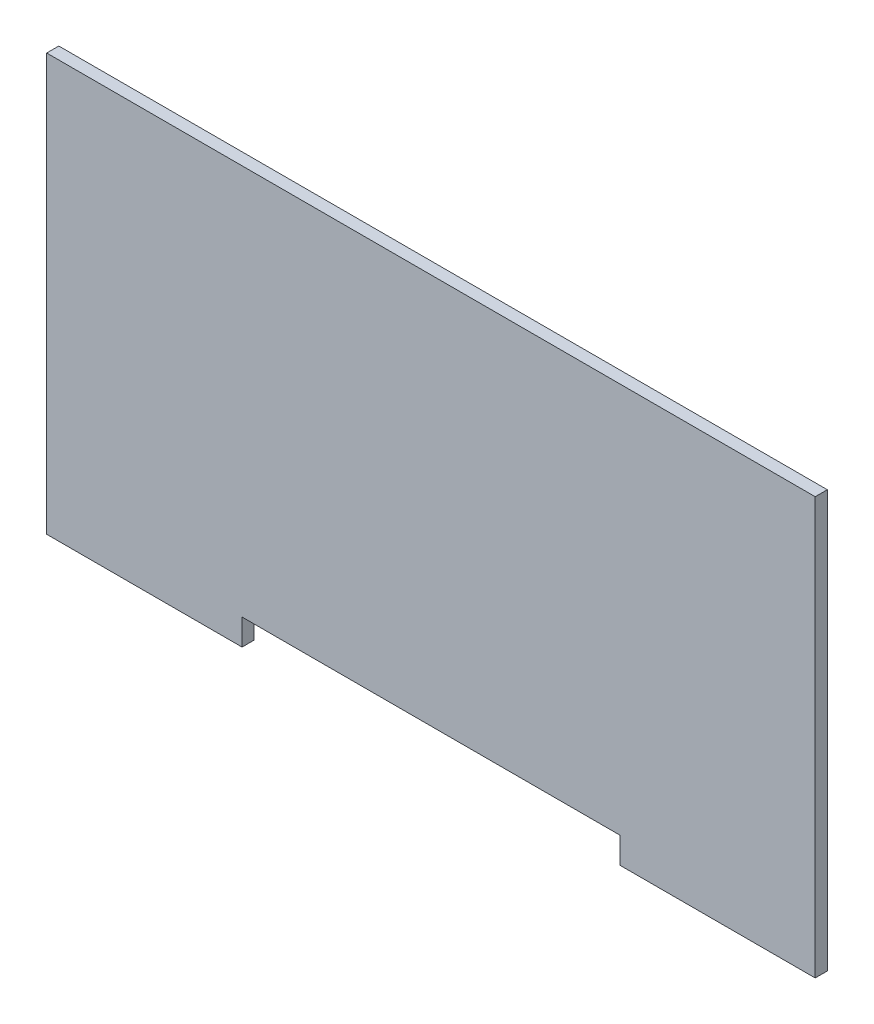
ISO-10303-21;
HEADER;
FILE_DESCRIPTION(('STEP AP214'),'2;1');
FILE_NAME('part.step','',(''),(''),'','','');
FILE_SCHEMA(('AUTOMOTIVE_DESIGN { 1 0 10303 214 1 1 1 1 }'));
ENDSEC;
DATA;
#1=APPLICATION_CONTEXT('core data for automotive mechanical design processes');
#2=APPLICATION_PROTOCOL_DEFINITION('international standard','automotive_design',2000,#1);
#3=PRODUCT_CONTEXT('',#1,'mechanical');
#4=PRODUCT('Part','Part','',(#3));
#5=PRODUCT_RELATED_PRODUCT_CATEGORY('part','',(#4));
#6=PRODUCT_DEFINITION_FORMATION('','',#4);
#7=PRODUCT_DEFINITION_CONTEXT('part definition',#1,'design');
#8=PRODUCT_DEFINITION('design','',#6,#7);
#9=PRODUCT_DEFINITION_SHAPE('','',#8);
#10=(LENGTH_UNIT() NAMED_UNIT(*) SI_UNIT(.MILLI.,.METRE.));
#11=(NAMED_UNIT(*) PLANE_ANGLE_UNIT() SI_UNIT($,.RADIAN.));
#12=(NAMED_UNIT(*) SI_UNIT($,.STERADIAN.) SOLID_ANGLE_UNIT());
#13=UNCERTAINTY_MEASURE_WITH_UNIT(LENGTH_MEASURE(1.E-05),#10,'distance_accuracy_value','');
#14=(GEOMETRIC_REPRESENTATION_CONTEXT(3) GLOBAL_UNCERTAINTY_ASSIGNED_CONTEXT((#13)) GLOBAL_UNIT_ASSIGNED_CONTEXT((#10,
#11,#12)) REPRESENTATION_CONTEXT('',''));
#15=CARTESIAN_POINT('',(0.,0.,0.));
#16=DIRECTION('',(0.,0.,1.));
#17=DIRECTION('',(1.,0.,0.));
#18=AXIS2_PLACEMENT_3D('',#15,#16,#17);
#19=CARTESIAN_POINT('',(147.5,0.,4.65));
#20=DIRECTION('',(1.,0.,0.));
#21=DIRECTION('',(0.,0.,-1.));
#22=AXIS2_PLACEMENT_3D('',#19,#20,#21);
#23=PLANE('',#22);
#24=DIRECTION('',(0.,-1.,0.));
#25=VECTOR('',#24,1.);
#26=CARTESIAN_POINT('',(147.5,0.,0.));
#27=LINE('',#26,#25);
#28=CARTESIAN_POINT('',(147.5,75.,0.));
#29=VERTEX_POINT('',#28);
#30=CARTESIAN_POINT('',(147.5,-85.,0.));
#31=VERTEX_POINT('',#30);
#32=EDGE_CURVE('E130',#29,#31,#27,.T.);
#33=ORIENTED_EDGE('',*,*,#32,.F.);
#34=DIRECTION('',(0.,0.,-1.));
#35=VECTOR('',#34,1.);
#36=CARTESIAN_POINT('',(147.5,75.,4.65));
#37=LINE('',#36,#35);
#38=CARTESIAN_POINT('',(147.5,75.,4.65));
#39=VERTEX_POINT('',#38);
#40=EDGE_CURVE('E81',#39,#29,#37,.T.);
#41=ORIENTED_EDGE('',*,*,#40,.F.);
#42=DIRECTION('',(0.,-1.,0.));
#43=VECTOR('',#42,1.);
#44=CARTESIAN_POINT('',(147.5,0.,4.65));
#45=LINE('',#44,#43);
#46=CARTESIAN_POINT('',(147.5,-85.,4.65));
#47=VERTEX_POINT('',#46);
#48=EDGE_CURVE('E157',#39,#47,#45,.T.);
#49=ORIENTED_EDGE('',*,*,#48,.T.);
#50=DIRECTION('',(0.,0.,-1.));
#51=VECTOR('',#50,1.);
#52=CARTESIAN_POINT('',(147.5,-85.,4.65));
#53=LINE('',#52,#51);
#54=EDGE_CURVE('E150',#47,#31,#53,.T.);
#55=ORIENTED_EDGE('',*,*,#54,.T.);
#56=EDGE_LOOP('',(#33,#41,#49,#55));
#57=FACE_BOUND('',#56,.T.);
#58=ADVANCED_FACE('F71',(#57),#23,.T.);
#59=CARTESIAN_POINT('',(0.,75.,4.65));
#60=DIRECTION('',(0.,1.,0.));
#61=DIRECTION('',(0.,0.,1.));
#62=AXIS2_PLACEMENT_3D('',#59,#60,#61);
#63=PLANE('',#62);
#64=DIRECTION('',(1.,0.,0.));
#65=VECTOR('',#64,1.);
#66=CARTESIAN_POINT('',(0.,75.,0.));
#67=LINE('',#66,#65);
#68=CARTESIAN_POINT('',(-147.5,75.,0.));
#69=VERTEX_POINT('',#68);
#70=EDGE_CURVE('E123',#69,#29,#67,.T.);
#71=ORIENTED_EDGE('',*,*,#70,.F.);
#72=DIRECTION('',(0.,0.,-1.));
#73=VECTOR('',#72,1.);
#74=CARTESIAN_POINT('',(-147.5,75.,4.65));
#75=LINE('',#74,#73);
#76=CARTESIAN_POINT('',(-147.5,75.,4.65));
#77=VERTEX_POINT('',#76);
#78=EDGE_CURVE('E117',#77,#69,#75,.T.);
#79=ORIENTED_EDGE('',*,*,#78,.F.);
#80=DIRECTION('',(1.,0.,0.));
#81=VECTOR('',#80,1.);
#82=CARTESIAN_POINT('',(0.,75.,4.65));
#83=LINE('',#82,#81);
#84=EDGE_CURVE('E175',#77,#39,#83,.T.);
#85=ORIENTED_EDGE('',*,*,#84,.T.);
#86=ORIENTED_EDGE('',*,*,#40,.T.);
#87=EDGE_LOOP('',(#71,#79,#85,#86));
#88=FACE_BOUND('',#87,.T.);
#89=ADVANCED_FACE('F210',(#88),#63,.T.);
#90=CARTESIAN_POINT('',(-147.5,0.,4.65));
#91=DIRECTION('',(1.,0.,0.));
#92=DIRECTION('',(0.,1.,0.));
#93=AXIS2_PLACEMENT_3D('',#90,#91,#92);
#94=PLANE('',#93);
#95=DIRECTION('',(0.,-1.,0.));
#96=VECTOR('',#95,1.);
#97=CARTESIAN_POINT('',(-147.5,0.,0.));
#98=LINE('',#97,#96);
#99=CARTESIAN_POINT('',(-147.5,-85.,0.));
#100=VERTEX_POINT('',#99);
#101=EDGE_CURVE('E109',#69,#100,#98,.T.);
#102=ORIENTED_EDGE('',*,*,#101,.T.);
#103=DIRECTION('',(0.,0.,-1.));
#104=VECTOR('',#103,1.);
#105=CARTESIAN_POINT('',(-147.5,-85.,4.65));
#106=LINE('',#105,#104);
#107=CARTESIAN_POINT('',(-147.5,-85.,4.65));
#108=VERTEX_POINT('',#107);
#109=EDGE_CURVE('E113',#108,#100,#106,.T.);
#110=ORIENTED_EDGE('',*,*,#109,.F.);
#111=DIRECTION('',(0.,-1.,0.));
#112=VECTOR('',#111,1.);
#113=CARTESIAN_POINT('',(-147.5,0.,4.65));
#114=LINE('',#113,#112);
#115=EDGE_CURVE('E173',#77,#108,#114,.T.);
#116=ORIENTED_EDGE('',*,*,#115,.F.);
#117=ORIENTED_EDGE('',*,*,#78,.T.);
#118=EDGE_LOOP('',(#102,#110,#116,#117));
#119=FACE_BOUND('',#118,.T.);
#120=ADVANCED_FACE('F111',(#119),#94,.F.);
#121=CARTESIAN_POINT('',(0.,-75.,4.65));
#122=DIRECTION('',(0.,1.,0.));
#123=DIRECTION('',(-1.,0.,0.));
#124=AXIS2_PLACEMENT_3D('',#121,#122,#123);
#125=PLANE('',#124);
#126=DIRECTION('',(1.,0.,0.));
#127=VECTOR('',#126,1.);
#128=CARTESIAN_POINT('',(0.,-75.,4.65));
#129=LINE('',#128,#127);
#130=CARTESIAN_POINT('',(-72.5,-75.,4.65));
#131=VERTEX_POINT('',#130);
#132=CARTESIAN_POINT('',(72.5,-75.,4.65));
#133=VERTEX_POINT('',#132);
#134=EDGE_CURVE('E170',#131,#133,#129,.T.);
#135=ORIENTED_EDGE('',*,*,#134,.F.);
#136=DIRECTION('',(0.,0.,-1.));
#137=VECTOR('',#136,1.);
#138=CARTESIAN_POINT('',(-72.5,-75.,4.65));
#139=LINE('',#138,#137);
#140=CARTESIAN_POINT('',(-72.5,-75.,0.));
#141=VERTEX_POINT('',#140);
#142=EDGE_CURVE('E12',#131,#141,#139,.T.);
#143=ORIENTED_EDGE('',*,*,#142,.T.);
#144=DIRECTION('',(1.,0.,0.));
#145=VECTOR('',#144,1.);
#146=CARTESIAN_POINT('',(0.,-75.,0.));
#147=LINE('',#146,#145);
#148=CARTESIAN_POINT('',(72.5,-75.,0.));
#149=VERTEX_POINT('',#148);
#150=EDGE_CURVE('E122',#141,#149,#147,.T.);
#151=ORIENTED_EDGE('',*,*,#150,.T.);
#152=DIRECTION('',(0.,0.,-1.));
#153=VECTOR('',#152,1.);
#154=CARTESIAN_POINT('',(72.5,-75.,4.65));
#155=LINE('',#154,#153);
#156=EDGE_CURVE('E144',#133,#149,#155,.T.);
#157=ORIENTED_EDGE('',*,*,#156,.F.);
#158=EDGE_LOOP('',(#135,#143,#151,#157));
#159=FACE_BOUND('',#158,.T.);
#160=ADVANCED_FACE('F225',(#159),#125,.F.);
#161=CARTESIAN_POINT('',(72.5,0.,4.65));
#162=DIRECTION('',(1.,0.,0.));
#163=DIRECTION('',(0.,0.,-1.));
#164=AXIS2_PLACEMENT_3D('',#161,#162,#163);
#165=PLANE('',#164);
#166=DIRECTION('',(0.,-1.,0.));
#167=VECTOR('',#166,1.);
#168=CARTESIAN_POINT('',(72.5,0.,0.));
#169=LINE('',#168,#167);
#170=CARTESIAN_POINT('',(72.5,-85.,0.));
#171=VERTEX_POINT('',#170);
#172=EDGE_CURVE('E158',#149,#171,#169,.T.);
#173=ORIENTED_EDGE('',*,*,#172,.T.);
#174=DIRECTION('',(0.,0.,-1.));
#175=VECTOR('',#174,1.);
#176=CARTESIAN_POINT('',(72.5,-85.,4.65));
#177=LINE('',#176,#175);
#178=CARTESIAN_POINT('',(72.5,-85.,4.65));
#179=VERTEX_POINT('',#178);
#180=EDGE_CURVE('E147',#179,#171,#177,.T.);
#181=ORIENTED_EDGE('',*,*,#180,.F.);
#182=DIRECTION('',(0.,-1.,0.));
#183=VECTOR('',#182,1.);
#184=CARTESIAN_POINT('',(72.5,0.,4.65));
#185=LINE('',#184,#183);
#186=EDGE_CURVE('E167',#133,#179,#185,.T.);
#187=ORIENTED_EDGE('',*,*,#186,.F.);
#188=ORIENTED_EDGE('',*,*,#156,.T.);
#189=EDGE_LOOP('',(#173,#181,#187,#188));
#190=FACE_BOUND('',#189,.T.);
#191=ADVANCED_FACE('F228',(#190),#165,.F.);
#192=CARTESIAN_POINT('',(0.,-85.,4.65));
#193=DIRECTION('',(0.,-1.,0.));
#194=DIRECTION('',(1.,0.,0.));
#195=AXIS2_PLACEMENT_3D('',#192,#193,#194);
#196=PLANE('',#195);
#197=DIRECTION('',(-1.,0.,0.));
#198=VECTOR('',#197,1.);
#199=CARTESIAN_POINT('',(0.,-85.,0.));
#200=LINE('',#199,#198);
#201=EDGE_CURVE('E154',#31,#171,#200,.T.);
#202=ORIENTED_EDGE('',*,*,#201,.F.);
#203=ORIENTED_EDGE('',*,*,#54,.F.);
#204=DIRECTION('',(-1.,0.,0.));
#205=VECTOR('',#204,1.);
#206=CARTESIAN_POINT('',(0.,-85.,4.65));
#207=LINE('',#206,#205);
#208=EDGE_CURVE('E153',#47,#179,#207,.T.);
#209=ORIENTED_EDGE('',*,*,#208,.T.);
#210=ORIENTED_EDGE('',*,*,#180,.T.);
#211=EDGE_LOOP('',(#202,#203,#209,#210));
#212=FACE_BOUND('',#211,.T.);
#213=ADVANCED_FACE('F196',(#212),#196,.T.);
#214=CARTESIAN_POINT('',(0.,0.,4.65));
#215=DIRECTION('',(0.,0.,1.));
#216=DIRECTION('',(1.,0.,0.));
#217=AXIS2_PLACEMENT_3D('',#214,#215,#216);
#218=PLANE('',#217);
#219=ORIENTED_EDGE('',*,*,#48,.F.);
#220=ORIENTED_EDGE('',*,*,#84,.F.);
#221=ORIENTED_EDGE('',*,*,#115,.T.);
#222=DIRECTION('',(1.,0.,0.));
#223=VECTOR('',#222,1.);
#224=CARTESIAN_POINT('',(-147.5,-85.,4.65));
#225=LINE('',#224,#223);
#226=CARTESIAN_POINT('',(-72.5,-85.,4.65));
#227=VERTEX_POINT('',#226);
#228=EDGE_CURVE('E129',#108,#227,#225,.T.);
#229=ORIENTED_EDGE('',*,*,#228,.T.);
#230=DIRECTION('',(0.,-1.,0.));
#231=VECTOR('',#230,1.);
#232=CARTESIAN_POINT('',(-72.5,-75.,4.65));
#233=LINE('',#232,#231);
#234=EDGE_CURVE('E135',#131,#227,#233,.T.);
#235=ORIENTED_EDGE('',*,*,#234,.F.);
#236=ORIENTED_EDGE('',*,*,#134,.T.);
#237=ORIENTED_EDGE('',*,*,#186,.T.);
#238=ORIENTED_EDGE('',*,*,#208,.F.);
#239=EDGE_LOOP('',(#219,#220,#221,#229,#235,#236,#237,#238));
#240=FACE_BOUND('',#239,.T.);
#241=ADVANCED_FACE('F191',(#240),#218,.T.);
#242=CARTESIAN_POINT('',(0.,0.,0.));
#243=DIRECTION('',(0.,0.,1.));
#244=DIRECTION('',(1.,0.,0.));
#245=AXIS2_PLACEMENT_3D('',#242,#243,#244);
#246=PLANE('',#245);
#247=ORIENTED_EDGE('',*,*,#32,.T.);
#248=ORIENTED_EDGE('',*,*,#201,.T.);
#249=ORIENTED_EDGE('',*,*,#172,.F.);
#250=ORIENTED_EDGE('',*,*,#150,.F.);
#251=DIRECTION('',(0.,-1.,0.));
#252=VECTOR('',#251,1.);
#253=CARTESIAN_POINT('',(-72.5,-75.,0.));
#254=LINE('',#253,#252);
#255=CARTESIAN_POINT('',(-72.5,-85.,0.));
#256=VERTEX_POINT('',#255);
#257=EDGE_CURVE('E134',#141,#256,#254,.T.);
#258=ORIENTED_EDGE('',*,*,#257,.T.);
#259=DIRECTION('',(1.,0.,0.));
#260=VECTOR('',#259,1.);
#261=CARTESIAN_POINT('',(-147.5,-85.,0.));
#262=LINE('',#261,#260);
#263=EDGE_CURVE('E127',#100,#256,#262,.T.);
#264=ORIENTED_EDGE('',*,*,#263,.F.);
#265=ORIENTED_EDGE('',*,*,#101,.F.);
#266=ORIENTED_EDGE('',*,*,#70,.T.);
#267=EDGE_LOOP('',(#247,#248,#249,#250,#258,#264,#265,#266));
#268=FACE_BOUND('',#267,.T.);
#269=ADVANCED_FACE('F132',(#268),#246,.F.);
#270=CARTESIAN_POINT('',(-147.5,-85.,4.65));
#271=DIRECTION('',(0.,1.,0.));
#272=DIRECTION('',(0.,0.,1.));
#273=AXIS2_PLACEMENT_3D('',#270,#271,#272);
#274=PLANE('',#273);
#275=ORIENTED_EDGE('',*,*,#263,.T.);
#276=DIRECTION('',(0.,0.,-1.));
#277=VECTOR('',#276,1.);
#278=CARTESIAN_POINT('',(-72.5,-85.,4.65));
#279=LINE('',#278,#277);
#280=EDGE_CURVE('E75',#227,#256,#279,.T.);
#281=ORIENTED_EDGE('',*,*,#280,.F.);
#282=ORIENTED_EDGE('',*,*,#228,.F.);
#283=ORIENTED_EDGE('',*,*,#109,.T.);
#284=EDGE_LOOP('',(#275,#281,#282,#283));
#285=FACE_BOUND('',#284,.T.);
#286=ADVANCED_FACE('F126',(#285),#274,.F.);
#287=CARTESIAN_POINT('',(-72.5,-75.,4.65));
#288=DIRECTION('',(1.,0.,0.));
#289=DIRECTION('',(0.,0.,-1.));
#290=AXIS2_PLACEMENT_3D('',#287,#288,#289);
#291=PLANE('',#290);
#292=ORIENTED_EDGE('',*,*,#257,.F.);
#293=ORIENTED_EDGE('',*,*,#142,.F.);
#294=ORIENTED_EDGE('',*,*,#234,.T.);
#295=ORIENTED_EDGE('',*,*,#280,.T.);
#296=EDGE_LOOP('',(#292,#293,#294,#295));
#297=FACE_BOUND('',#296,.T.);
#298=ADVANCED_FACE('F73',(#297),#291,.T.);
#299=CLOSED_SHELL('',(#58,#89,#120,#160,#191,#213,#241,#269,#286,#298));
#300=MANIFOLD_SOLID_BREP('B2',#299);
#301=ADVANCED_BREP_SHAPE_REPRESENTATION('',(#18,#300),#14);
#302=SHAPE_DEFINITION_REPRESENTATION(#9,#301);
ENDSEC;
END-ISO-10303-21;
